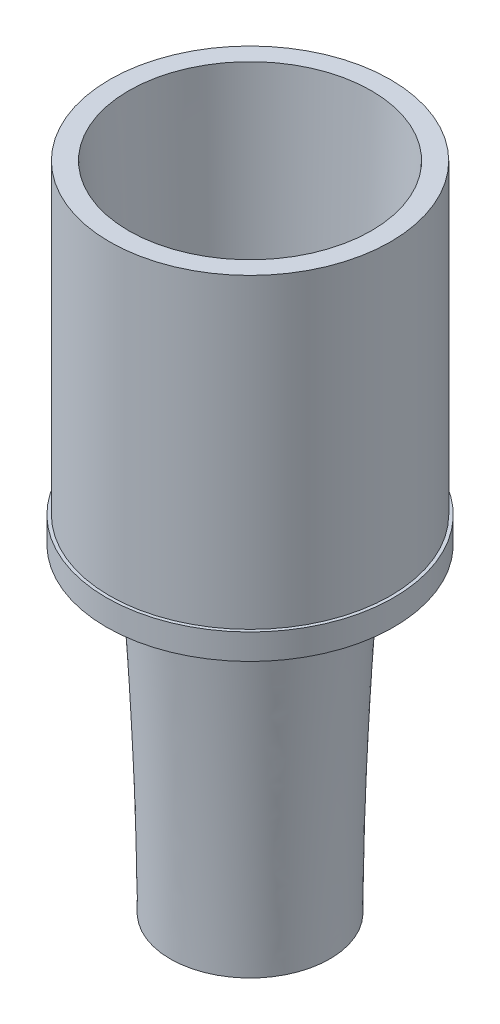
ISO-10303-21;
HEADER;
FILE_DESCRIPTION(('STEP AP214'),'2;1');
FILE_NAME('part.step','',(''),(''),'','','');
FILE_SCHEMA(('AUTOMOTIVE_DESIGN { 1 0 10303 214 1 1 1 1 }'));
ENDSEC;
DATA;
#1=APPLICATION_CONTEXT('core data for automotive mechanical design processes');
#2=APPLICATION_PROTOCOL_DEFINITION('international standard','automotive_design',2000,#1);
#3=PRODUCT_CONTEXT('',#1,'mechanical');
#4=PRODUCT('Part','Part','',(#3));
#5=PRODUCT_RELATED_PRODUCT_CATEGORY('part','',(#4));
#6=PRODUCT_DEFINITION_FORMATION('','',#4);
#7=PRODUCT_DEFINITION_CONTEXT('part definition',#1,'design');
#8=PRODUCT_DEFINITION('design','',#6,#7);
#9=PRODUCT_DEFINITION_SHAPE('','',#8);
#10=(LENGTH_UNIT() NAMED_UNIT(*) SI_UNIT(.MILLI.,.METRE.));
#11=(NAMED_UNIT(*) PLANE_ANGLE_UNIT() SI_UNIT($,.RADIAN.));
#12=(NAMED_UNIT(*) SI_UNIT($,.STERADIAN.) SOLID_ANGLE_UNIT());
#13=UNCERTAINTY_MEASURE_WITH_UNIT(LENGTH_MEASURE(1.E-05),#10,'distance_accuracy_value','');
#14=(GEOMETRIC_REPRESENTATION_CONTEXT(3) GLOBAL_UNCERTAINTY_ASSIGNED_CONTEXT((#13)) GLOBAL_UNIT_ASSIGNED_CONTEXT((#10,
#11,#12)) REPRESENTATION_CONTEXT('',''));
#15=CARTESIAN_POINT('',(0.,0.,0.));
#16=DIRECTION('',(0.,0.,1.));
#17=DIRECTION('',(1.,0.,0.));
#18=AXIS2_PLACEMENT_3D('',#15,#16,#17);
#19=CARTESIAN_POINT('',(0.,27.,0.));
#20=DIRECTION('',(0.,1.,0.));
#21=DIRECTION('',(0.,0.,1.));
#22=AXIS2_PLACEMENT_3D('',#19,#20,#21);
#23=PLANE('',#22);
#24=CARTESIAN_POINT('',(0.,27.,0.));
#25=DIRECTION('',(0.,1.,0.));
#26=DIRECTION('',(0.,0.,1.));
#27=AXIS2_PLACEMENT_3D('',#24,#25,#26);
#28=CIRCLE('',#27,5.75);
#29=CARTESIAN_POINT('',(0.,27.,5.75));
#30=VERTEX_POINT('',#29);
#31=EDGE_CURVE('E172',#30,#30,#28,.T.);
#32=ORIENTED_EDGE('',*,*,#31,.F.);
#33=EDGE_LOOP('',(#32));
#34=FACE_BOUND('',#33,.T.);
#35=CARTESIAN_POINT('',(0.,27.,0.));
#36=DIRECTION('',(0.,-1.,0.));
#37=DIRECTION('',(0.,0.,1.));
#38=AXIS2_PLACEMENT_3D('',#35,#36,#37);
#39=CIRCLE('',#38,8.5);
#40=CARTESIAN_POINT('',(0.,27.,8.5));
#41=VERTEX_POINT('',#40);
#42=EDGE_CURVE('E175',#41,#41,#39,.T.);
#43=ORIENTED_EDGE('',*,*,#42,.F.);
#44=EDGE_LOOP('',(#43));
#45=FACE_BOUND('',#44,.T.);
#46=ADVANCED_FACE('F55',(#34,#45),#23,.T.);
#47=CARTESIAN_POINT('',(0.,25.,0.));
#48=DIRECTION('',(0.,-1.,0.));
#49=DIRECTION('',(0.,0.,-1.));
#50=AXIS2_PLACEMENT_3D('',#47,#48,#49);
#51=CYLINDRICAL_SURFACE('',#50,7.25);
#52=CARTESIAN_POINT('',(0.,25.,0.));
#53=DIRECTION('',(0.,1.,0.));
#54=DIRECTION('',(0.,0.,1.));
#55=AXIS2_PLACEMENT_3D('',#52,#53,#54);
#56=CIRCLE('',#55,7.25);
#57=CARTESIAN_POINT('',(0.,25.,7.25));
#58=VERTEX_POINT('',#57);
#59=EDGE_CURVE('E65',#58,#58,#56,.T.);
#60=ORIENTED_EDGE('',*,*,#59,.F.);
#61=EDGE_LOOP('',(#60));
#62=FACE_BOUND('',#61,.T.);
#63=CARTESIAN_POINT('',(0.,24.5,0.));
#64=DIRECTION('',(0.,1.,0.));
#65=DIRECTION('',(0.,0.,1.));
#66=AXIS2_PLACEMENT_3D('',#63,#64,#65);
#67=CIRCLE('',#66,7.25);
#68=CARTESIAN_POINT('',(0.,24.5,7.25));
#69=VERTEX_POINT('',#68);
#70=EDGE_CURVE('E70',#69,#69,#67,.T.);
#71=ORIENTED_EDGE('',*,*,#70,.T.);
#72=EDGE_LOOP('',(#71));
#73=FACE_BOUND('',#72,.T.);
#74=ADVANCED_FACE('F162',(#62,#73),#51,.T.);
#75=CARTESIAN_POINT('',(0.,24.5,0.));
#76=DIRECTION('',(0.,1.,0.));
#77=DIRECTION('',(0.,0.,1.));
#78=AXIS2_PLACEMENT_3D('',#75,#76,#77);
#79=PLANE('',#78);
#80=CARTESIAN_POINT('',(0.,24.5,0.));
#81=DIRECTION('',(0.,1.,0.));
#82=DIRECTION('',(0.,0.,1.));
#83=AXIS2_PLACEMENT_3D('',#80,#81,#82);
#84=CIRCLE('',#83,7.21567156660949);
#85=CARTESIAN_POINT('',(-4.4192510764658,24.5,-5.70404558890727));
#86=VERTEX_POINT('',#85);
#87=EDGE_CURVE('E74',#86,#86,#84,.T.);
#88=ORIENTED_EDGE('',*,*,#87,.T.);
#89=EDGE_LOOP('',(#88));
#90=FACE_BOUND('',#89,.T.);
#91=ORIENTED_EDGE('',*,*,#70,.F.);
#92=EDGE_LOOP('',(#91));
#93=FACE_BOUND('',#92,.T.);
#94=ADVANCED_FACE('F167',(#90,#93),#79,.F.);
#95=CARTESIAN_POINT('',(-1.11708454091989,0.,-6.14935948928324));
#96=CARTESIAN_POINT('',(-4.48664223025245,25.,-5.69495755012409));
#97=CARTESIAN_POINT('',(-13.4158035194864,0.,-3.91519040744345));
#98=CARTESIAN_POINT('',(-15.8765573305006,25.,3.2783269103808));
#99=CARTESIAN_POINT('',(-11.1816344376466,0.,8.38352857112303));
#100=CARTESIAN_POINT('',(-6.90327286999572,25.,14.668242010629));
#101=CARTESIAN_POINT('',(1.1170845409199,0.,6.14935948928324));
#102=CARTESIAN_POINT('',(4.48664223025244,25.,5.69495755012409));
#103=CARTESIAN_POINT('',(13.4158035194864,0.,3.91519040744344));
#104=CARTESIAN_POINT('',(15.8765573305006,25.,-3.2783269103808));
#105=CARTESIAN_POINT('',(11.1816344376466,0.,-8.38352857112303));
#106=CARTESIAN_POINT('',(6.90327286999574,25.,-14.668242010629));
#107=CARTESIAN_POINT('',(-1.11708454091989,0.,-6.14935948928324));
#108=CARTESIAN_POINT('',(-4.48664223025245,25.,-5.69495755012409));
#109=(BOUNDED_SURFACE() B_SPLINE_SURFACE(3,1,((#95,#96),(#97,#98),(#99,#100),(#101,#102),(#103,
#104),(#105,#106),(#107,#108)),.UNSPECIFIED.,.T.,.F.,.F.) B_SPLINE_SURFACE_WITH_KNOTS((4,3,4),
(2,2),(0.,0.5,1.),(0.,1.),
.UNSPECIFIED.) GEOMETRIC_REPRESENTATION_ITEM() RATIONAL_B_SPLINE_SURFACE(((1.,1.),
(0.333333333333333,0.333333333333334),(0.333333333333333,0.333333333333334),(1.,1.),
(0.333333333333333,0.333333333333333),(0.333333333333333,0.333333333333333),(1.,1.))) REPRESENTATION_ITEM('') SURFACE());
#110=CARTESIAN_POINT('',(0.,0.,0.));
#111=DIRECTION('',(0.,1.,0.));
#112=DIRECTION('',(0.,0.,1.));
#113=AXIS2_PLACEMENT_3D('',#110,#111,#112);
#114=CIRCLE('',#113,6.25);
#115=CARTESIAN_POINT('',(-1.11708454091989,0.,-6.14935948928324));
#116=VERTEX_POINT('',#115);
#117=EDGE_CURVE('E12',#116,#116,#114,.T.);
#118=CARTESIAN_POINT('',(-1.11708454091989,0.,-6.14935948928324));
#119=CARTESIAN_POINT('',(-1.1514821089985,0.255208333333334,-6.14472080282099));
#120=CARTESIAN_POINT('',(-1.1858796770771,0.510416666666667,-6.14008211635874));
#121=CARTESIAN_POINT('',(-1.25467481323431,1.02083333333333,-6.13080474343424));
#122=CARTESIAN_POINT('',(-1.28907238131291,1.27604166666667,-6.12616605697199));
#123=CARTESIAN_POINT('',(-1.35786751747012,1.78645833333333,-6.11688868404749));
#124=CARTESIAN_POINT('',(-1.39226508554872,2.04166666666667,-6.11224999758524));
#125=CARTESIAN_POINT('',(-1.46106022170593,2.55208333333333,-6.10297262466074));
#126=CARTESIAN_POINT('',(-1.49545778978453,2.80729166666667,-6.09833393819849));
#127=CARTESIAN_POINT('',(-1.56425292594174,3.31770833333333,-6.08905656527399));
#128=CARTESIAN_POINT('',(-1.59865049402034,3.57291666666667,-6.08441787881174));
#129=CARTESIAN_POINT('',(-1.66744563017754,4.08333333333333,-6.07514050588724));
#130=CARTESIAN_POINT('',(-1.70184319825615,4.33854166666667,-6.07050181942499));
#131=CARTESIAN_POINT('',(-1.77063833441335,4.84895833333333,-6.06122444650049));
#132=CARTESIAN_POINT('',(-1.80503590249196,5.10416666666667,-6.05658576003824));
#133=CARTESIAN_POINT('',(-1.87383103864916,5.61458333333333,-6.04730838711374));
#134=CARTESIAN_POINT('',(-1.90822860672777,5.86979166666667,-6.0426697006515));
#135=CARTESIAN_POINT('',(-1.97702374288497,6.38020833333333,-6.033392327727));
#136=CARTESIAN_POINT('',(-2.01142131096358,6.63541666666667,-6.02875364126475));
#137=CARTESIAN_POINT('',(-2.08021644712078,7.14583333333333,-6.01947626834025));
#138=CARTESIAN_POINT('',(-2.11461401519939,7.40104166666667,-6.014837581878));
#139=CARTESIAN_POINT('',(-2.18340915135659,7.91145833333333,-6.0055602089535));
#140=CARTESIAN_POINT('',(-2.2178067194352,8.16666666666667,-6.00092152249125));
#141=CARTESIAN_POINT('',(-2.2866018555924,8.67708333333333,-5.99164414956675));
#142=CARTESIAN_POINT('',(-2.32099942367101,8.93229166666667,-5.9870054631045));
#143=CARTESIAN_POINT('',(-2.38979455982821,9.44270833333333,-5.97772809018));
#144=CARTESIAN_POINT('',(-2.42419212790681,9.69791666666667,-5.97308940371775));
#145=CARTESIAN_POINT('',(-2.49298726406402,10.2083333333333,-5.96381203079325));
#146=CARTESIAN_POINT('',(-2.52738483214262,10.4635416666667,-5.959173344331));
#147=CARTESIAN_POINT('',(-2.59617996829983,10.9739583333333,-5.9498959714065));
#148=CARTESIAN_POINT('',(-2.63057753637843,11.2291666666667,-5.94525728494425));
#149=CARTESIAN_POINT('',(-2.69937267253564,11.7395833333333,-5.93597991201975));
#150=CARTESIAN_POINT('',(-2.73377024061424,11.9947916666667,-5.9313412255575));
#151=CARTESIAN_POINT('',(-2.80256537677145,12.5052083333333,-5.922063852633));
#152=CARTESIAN_POINT('',(-2.83696294485005,12.7604166666667,-5.91742516617075));
#153=CARTESIAN_POINT('',(-2.90575808100726,13.2708333333333,-5.90814779324625));
#154=CARTESIAN_POINT('',(-2.94015564908586,13.5260416666667,-5.903509106784));
#155=CARTESIAN_POINT('',(-3.00895078524307,14.0364583333333,-5.89423173385951));
#156=CARTESIAN_POINT('',(-3.04334835332167,14.2916666666667,-5.88959304739726));
#157=CARTESIAN_POINT('',(-3.11214348947888,14.8020833333333,-5.88031567447276));
#158=CARTESIAN_POINT('',(-3.14654105755748,15.0572916666667,-5.87567698801051));
#159=CARTESIAN_POINT('',(-3.21533619371469,15.5677083333333,-5.86639961508601));
#160=CARTESIAN_POINT('',(-3.24973376179329,15.8229166666667,-5.86176092862376));
#161=CARTESIAN_POINT('',(-3.3185288979505,16.3333333333333,-5.85248355569926));
#162=CARTESIAN_POINT('',(-3.3529264660291,16.5885416666667,-5.84784486923701));
#163=CARTESIAN_POINT('',(-3.42172160218631,17.0989583333333,-5.83856749631251));
#164=CARTESIAN_POINT('',(-3.45611917026491,17.3541666666667,-5.83392880985026));
#165=CARTESIAN_POINT('',(-3.52491430642212,17.8645833333333,-5.82465143692576));
#166=CARTESIAN_POINT('',(-3.55931187450072,18.1197916666667,-5.82001275046351));
#167=CARTESIAN_POINT('',(-3.62810701065793,18.6302083333333,-5.81073537753901));
#168=CARTESIAN_POINT('',(-3.66250457873653,18.8854166666667,-5.80609669107676));
#169=CARTESIAN_POINT('',(-3.73129971489373,19.3958333333333,-5.79681931815226));
#170=CARTESIAN_POINT('',(-3.76569728297234,19.6510416666667,-5.79218063169001));
#171=CARTESIAN_POINT('',(-3.83449241912954,20.1614583333333,-5.78290325876551));
#172=CARTESIAN_POINT('',(-3.86888998720815,20.4166666666667,-5.77826457230326));
#173=CARTESIAN_POINT('',(-3.93768512336535,20.9270833333333,-5.76898719937877));
#174=CARTESIAN_POINT('',(-3.97208269144396,21.1822916666667,-5.76434851291652));
#175=CARTESIAN_POINT('',(-4.04087782760116,21.6927083333333,-5.75507113999202));
#176=CARTESIAN_POINT('',(-4.07527539567977,21.9479166666667,-5.75043245352977));
#177=CARTESIAN_POINT('',(-4.14407053183697,22.4583333333333,-5.74115508060527));
#178=CARTESIAN_POINT('',(-4.17846809991558,22.7135416666667,-5.73651639414302));
#179=CARTESIAN_POINT('',(-4.24726323607278,23.2239583333333,-5.72723902121852));
#180=CARTESIAN_POINT('',(-4.28166080415139,23.4791666666667,-5.72260033475627));
#181=CARTESIAN_POINT('',(-4.35045594030859,23.9895833333333,-5.71332296183177));
#182=CARTESIAN_POINT('',(-4.3848535083872,24.2447916666667,-5.70868427536952));
#183=CARTESIAN_POINT('',(-4.4192510764658,24.5,-5.70404558890727));
#184=B_SPLINE_CURVE_WITH_KNOTS('',3,(#118,#119,#120,#121,#122,#123,#124,#125,#126,#127,#128,
#129,#130,#131,#132,#133,#134,#135,#136,#137,#138,#139,#140,#141,#142,#143,#144,#145,#146,#147,
#148,#149,#150,#151,#152,#153,#154,#155,#156,#157,#158,#159,#160,#161,#162,#163,#164,#165,#166,
#167,#168,#169,#170,#171,#172,#173,#174,#175,#176,#177,#178,#179,#180,#181,#182,#183),
.UNSPECIFIED.,.F.,.F.,(4,2,2,2,2,2,2,2,2,2,2,2,2,2,2,2,2,2,2,2,2,2,2,2,2,2,2,2,2,2,2,2,4),(0.,
0.77267330194679,1.54534660389358,2.31801990584037,3.09069320778716,3.86336650973395,
4.63603981168074,5.40871311362753,6.18138641557432,6.95405971752111,7.7267330194679,
8.49940632141469,9.27207962336148,10.0447529253083,10.8174262272551,11.5900995292018,
12.3627728311486,13.1354461330954,13.9081194350422,14.680792736989,15.4534660389358,
16.2261393408826,16.9988126428294,17.7714859447762,18.5441592467229,19.3168325486697,
20.0895058506165,20.8621791525633,21.6348524545101,22.4075257564569,23.1801990584037,
23.9528723603505,24.7255456622973),.UNSPECIFIED.);
#185=EDGE_CURVE('BSEAM111',#116,#86,#184,.T.);
#186=ORIENTED_EDGE('',*,*,#117,.T.);
#187=ORIENTED_EDGE('',*,*,#87,.F.);
#188=ORIENTED_EDGE('',*,*,#185,.T.);
#189=ORIENTED_EDGE('',*,*,#185,.F.);
#190=EDGE_LOOP('',(#186,#188,#187,#189));
#191=FACE_BOUND('',#190,.T.);
#192=ADVANCED_FACE('F111',(#191),#109,.T.);
#193=CARTESIAN_POINT('',(0.,0.,0.));
#194=DIRECTION('',(0.,1.,0.));
#195=DIRECTION('',(0.,0.,1.));
#196=AXIS2_PLACEMENT_3D('',#193,#194,#195);
#197=PLANE('',#196);
#198=CARTESIAN_POINT('',(0.,0.,0.));
#199=DIRECTION('',(0.,-1.,0.));
#200=DIRECTION('',(0.,0.,-1.));
#201=AXIS2_PLACEMENT_3D('',#198,#199,#200);
#202=CIRCLE('',#201,4.75);
#203=CARTESIAN_POINT('',(0.,0.,-4.75));
#204=VERTEX_POINT('',#203);
#205=EDGE_CURVE('E76',#204,#204,#202,.T.);
#206=ORIENTED_EDGE('',*,*,#205,.F.);
#207=EDGE_LOOP('',(#206));
#208=FACE_BOUND('',#207,.T.);
#209=ORIENTED_EDGE('',*,*,#117,.F.);
#210=EDGE_LOOP('',(#209));
#211=FACE_BOUND('',#210,.T.);
#212=ADVANCED_FACE('F57',(#208,#211),#197,.F.);
#213=CARTESIAN_POINT('',(-5.75,25.,0.));
#214=CARTESIAN_POINT('',(-5.41666666666667,16.6666666666667,0.));
#215=CARTESIAN_POINT('',(-5.08333333333333,8.33333333333334,0.));
#216=CARTESIAN_POINT('',(-4.75,0.,0.));
#217=CARTESIAN_POINT('',(-5.75,25.,-0.158675565352893));
#218=CARTESIAN_POINT('',(-5.41666666666667,16.6666666666667,-0.149476981854173));
#219=CARTESIAN_POINT('',(-5.08333333333333,8.33333333333334,-0.140278398355454));
#220=CARTESIAN_POINT('',(-4.75,0.,-0.131079814856734));
#221=CARTESIAN_POINT('',(-5.73711755653529,25.,-0.473041582988096));
#222=CARTESIAN_POINT('',(-5.40453103151875,16.6666666666667,-0.445618882525017));
#223=CARTESIAN_POINT('',(-5.07194450650221,8.33333333333334,-0.418196182061938));
#224=CARTESIAN_POINT('',(-4.73935798148567,0.,-0.390773481598859));
#225=CARTESIAN_POINT('',(-5.68063116050321,25.,-0.934150670670049));
#226=CARTESIAN_POINT('',(-5.35131920916969,16.6666666666667,-0.879997008602219));
#227=CARTESIAN_POINT('',(-5.02200725783617,8.33333333333334,-0.825843346534389));
#228=CARTESIAN_POINT('',(-4.69269530650265,0.,-0.771689684466559));
#229=CARTESIAN_POINT('',(-5.58846663319524,25.,-1.38333522002203));
#230=CARTESIAN_POINT('',(-5.26449755301001,16.6666666666667,-1.30314187393379));
#231=CARTESIAN_POINT('',(-4.94052847282478,8.33333333333334,-1.22294852784556));
#232=CARTESIAN_POINT('',(-4.61655939263955,0.,-1.14275518175732));
#233=CARTESIAN_POINT('',(-4.83031827904677,25.,-3.99798768879932));
#234=CARTESIAN_POINT('',(-4.55029982808753,16.6666666666667,-3.76622028655009));
#235=CARTESIAN_POINT('',(-4.2702813771283,8.33333333333334,-3.53445288430085));
#236=CARTESIAN_POINT('',(-3.99026292616907,0.,-3.30268548205161));
#237=CARTESIAN_POINT('',(-2.53880904564626,25.,-5.75));
#238=CARTESIAN_POINT('',(-2.39163170966677,16.6666666666667,-5.41666666666667));
#239=CARTESIAN_POINT('',(-2.24445437368727,8.33333333333334,-5.08333333333333));
#240=CARTESIAN_POINT('',(-2.09727703770778,0.,-4.75));
#241=CARTESIAN_POINT('',(3.17351130705783,25.,-5.75));
#242=CARTESIAN_POINT('',(2.98953963708346,16.6666666666667,-5.41666666666667));
#243=CARTESIAN_POINT('',(2.80556796710909,8.33333333333334,-5.08333333333333));
#244=CARTESIAN_POINT('',(2.62159629713472,0.,-4.75));
#245=CARTESIAN_POINT('',(5.75,25.,-3.17351130705782));
#246=CARTESIAN_POINT('',(5.41666666666667,16.6666666666667,-2.98953963708346));
#247=CARTESIAN_POINT('',(5.08333333333333,8.33333333333334,-2.80556796710909));
#248=CARTESIAN_POINT('',(4.75,0.,-2.62159629713473));
#249=CARTESIAN_POINT('',(5.75,25.,3.17351130705783));
#250=CARTESIAN_POINT('',(5.41666666666667,16.6666666666667,2.98953963708346));
#251=CARTESIAN_POINT('',(5.08333333333333,8.33333333333334,2.80556796710909));
#252=CARTESIAN_POINT('',(4.75,0.,2.62159629713472));
#253=CARTESIAN_POINT('',(3.17351130705782,25.,5.75));
#254=CARTESIAN_POINT('',(2.98953963708346,16.6666666666667,5.41666666666667));
#255=CARTESIAN_POINT('',(2.80556796710909,8.33333333333334,5.08333333333333));
#256=CARTESIAN_POINT('',(2.62159629713473,0.,4.75));
#257=CARTESIAN_POINT('',(-2.53880904564626,25.,5.75));
#258=CARTESIAN_POINT('',(-2.39163170966677,16.6666666666667,5.41666666666667));
#259=CARTESIAN_POINT('',(-2.24445437368727,8.33333333333334,5.08333333333333));
#260=CARTESIAN_POINT('',(-2.09727703770778,0.,4.75));
#261=CARTESIAN_POINT('',(-4.83031827904677,25.,3.99798768879932));
#262=CARTESIAN_POINT('',(-4.55029982808754,16.6666666666667,3.76622028655009));
#263=CARTESIAN_POINT('',(-4.2702813771283,8.33333333333334,3.53445288430085));
#264=CARTESIAN_POINT('',(-3.99026292616907,0.,3.30268548205162));
#265=CARTESIAN_POINT('',(-5.58846663319524,25.,1.38333522002202));
#266=CARTESIAN_POINT('',(-5.26449755301001,16.6666666666667,1.30314187393379));
#267=CARTESIAN_POINT('',(-4.94052847282478,8.33333333333334,1.22294852784556));
#268=CARTESIAN_POINT('',(-4.61655939263955,0.,1.14275518175733));
#269=CARTESIAN_POINT('',(-5.68063116050321,25.,0.934150670670045));
#270=CARTESIAN_POINT('',(-5.35131920916969,16.6666666666667,0.879997008602217));
#271=CARTESIAN_POINT('',(-5.02200725783617,8.33333333333334,0.82584334653439));
#272=CARTESIAN_POINT('',(-4.69269530650265,0.,0.771689684466562));
#273=CARTESIAN_POINT('',(-5.73711755653529,25.,0.473041582988094));
#274=CARTESIAN_POINT('',(-5.40453103151875,16.6666666666667,0.445618882525017));
#275=CARTESIAN_POINT('',(-5.07194450650221,8.33333333333334,0.41819618206194));
#276=CARTESIAN_POINT('',(-4.73935798148567,0.,0.390773481598863));
#277=CARTESIAN_POINT('',(-5.75,25.,0.158675565352889));
#278=CARTESIAN_POINT('',(-5.41666666666667,16.6666666666667,0.149476981854172));
#279=CARTESIAN_POINT('',(-5.08333333333333,8.33333333333334,0.140278398355455));
#280=CARTESIAN_POINT('',(-4.75,0.,0.131079814856737));
#281=CARTESIAN_POINT('',(-5.75,25.,0.));
#282=CARTESIAN_POINT('',(-5.41666666666667,16.6666666666667,0.));
#283=CARTESIAN_POINT('',(-5.08333333333333,8.33333333333334,0.));
#284=CARTESIAN_POINT('',(-4.75,0.,0.));
#285=B_SPLINE_SURFACE_WITH_KNOTS('',3,3,((#213,#214,#215,#216),(#217,#218,#219,#220),(#221,#222,
#223,#224),(#225,#226,#227,#228),(#229,#230,#231,#232),(#233,#234,#235,#236),(#237,#238,#239,
#240),(#241,#242,#243,#244),(#245,#246,#247,#248),(#249,#250,#251,#252),(#253,#254,#255,#256),
(#257,#258,#259,#260),(#261,#262,#263,#264),(#265,#266,#267,#268),(#269,#270,#271,#272),(#273,
#274,#275,#276),(#277,#278,#279,#280),(#281,#282,#283,#284)),.UNSPECIFIED.,.T.,.F.,.F.,(4,1,1,1,
1,2,2,2,1,1,1,1,4),(4,4),(0.,0.0125,0.0249999999999999,0.0375000000000001,0.05,0.25,0.5,0.75,
0.95,0.9625,0.975,0.9875,1.),(0.,1.),.UNSPECIFIED.);
#286=CARTESIAN_POINT('',(-5.75,25.,0.));
#287=CARTESIAN_POINT('',(-5.75,25.,0.158675565352889));
#288=CARTESIAN_POINT('',(-5.73711755653529,25.,0.473041582988094));
#289=CARTESIAN_POINT('',(-5.68063116050321,25.,0.934150670670045));
#290=CARTESIAN_POINT('',(-5.58846663319524,25.,1.38333522002202));
#291=CARTESIAN_POINT('',(-4.83031827904677,25.,3.99798768879932));
#292=CARTESIAN_POINT('',(-2.53880904564626,25.,5.75));
#293=CARTESIAN_POINT('',(3.17351130705782,25.,5.75));
#294=CARTESIAN_POINT('',(5.75,25.,3.17351130705783));
#295=CARTESIAN_POINT('',(5.75,25.,-3.17351130705782));
#296=CARTESIAN_POINT('',(3.17351130705783,25.,-5.75));
#297=CARTESIAN_POINT('',(-2.53880904564626,25.,-5.75));
#298=CARTESIAN_POINT('',(-4.83031827904677,25.,-3.99798768879932));
#299=CARTESIAN_POINT('',(-5.58846663319524,25.,-1.38333522002203));
#300=CARTESIAN_POINT('',(-5.68063116050321,25.,-0.934150670670049));
#301=CARTESIAN_POINT('',(-5.73711755653529,25.,-0.473041582988096));
#302=CARTESIAN_POINT('',(-5.75,25.,-0.158675565352893));
#303=CARTESIAN_POINT('',(-5.75,25.,0.));
#304=B_SPLINE_CURVE_WITH_KNOTS('',3,(#286,#287,#288,#289,#290,#291,#292,#293,#294,#295,#296,
#297,#298,#299,#300,#301,#302,#303),.UNSPECIFIED.,.T.,.F.,(4,1,1,1,1,2,2,2,1,1,1,1,4),(0.,
0.0125,0.025,0.0375,0.05,0.25,0.5,0.75,0.95,0.9625,0.975,0.9875,1.),.UNSPECIFIED.);
#305=CARTESIAN_POINT('',(-5.75,25.,0.));
#306=VERTEX_POINT('',#305);
#307=EDGE_CURVE('E132',#306,#306,#304,.T.);
#308=ORIENTED_EDGE('',*,*,#307,.T.);
#309=EDGE_LOOP('',(#308));
#310=FACE_BOUND('',#309,.T.);
#311=ORIENTED_EDGE('',*,*,#205,.T.);
#312=EDGE_LOOP('',(#311));
#313=FACE_BOUND('',#312,.T.);
#314=ADVANCED_FACE('F95',(#310,#313),#285,.F.);
#315=CARTESIAN_POINT('',(0.,25.,0.));
#316=DIRECTION('',(0.,1.,0.));
#317=DIRECTION('',(0.,0.,1.));
#318=AXIS2_PLACEMENT_3D('',#315,#316,#317);
#319=PLANE('',#318);
#320=CARTESIAN_POINT('',(0.,25.,0.));
#321=DIRECTION('',(0.,1.,0.));
#322=DIRECTION('',(0.,0.,1.));
#323=AXIS2_PLACEMENT_3D('',#320,#321,#322);
#324=CIRCLE('',#323,11.25);
#325=CARTESIAN_POINT('',(0.,25.,11.25));
#326=VERTEX_POINT('',#325);
#327=EDGE_CURVE('E86',#326,#326,#324,.T.);
#328=ORIENTED_EDGE('',*,*,#327,.F.);
#329=EDGE_LOOP('',(#328));
#330=FACE_BOUND('',#329,.T.);
#331=ORIENTED_EDGE('',*,*,#59,.T.);
#332=EDGE_LOOP('',(#331));
#333=FACE_BOUND('',#332,.T.);
#334=ADVANCED_FACE('F107',(#330,#333),#319,.F.);
#335=CARTESIAN_POINT('',(0.,27.,0.));
#336=DIRECTION('',(0.,1.,0.));
#337=DIRECTION('',(0.,0.,1.));
#338=AXIS2_PLACEMENT_3D('',#335,#336,#337);
#339=CIRCLE('',#338,11.);
#340=CARTESIAN_POINT('',(0.,27.,11.));
#341=VERTEX_POINT('',#340);
#342=EDGE_CURVE('E177',#341,#341,#339,.T.);
#343=ORIENTED_EDGE('',*,*,#342,.F.);
#344=EDGE_LOOP('',(#343));
#345=FACE_BOUND('',#344,.T.);
#346=CARTESIAN_POINT('',(0.,27.,0.));
#347=DIRECTION('',(0.,1.,0.));
#348=DIRECTION('',(0.,0.,1.));
#349=AXIS2_PLACEMENT_3D('',#346,#347,#348);
#350=CIRCLE('',#349,11.25);
#351=CARTESIAN_POINT('',(0.,27.,11.25));
#352=VERTEX_POINT('',#351);
#353=EDGE_CURVE('E83',#352,#352,#350,.T.);
#354=ORIENTED_EDGE('',*,*,#353,.T.);
#355=EDGE_LOOP('',(#354));
#356=FACE_BOUND('',#355,.T.);
#357=ADVANCED_FACE('F152',(#345,#356),#23,.T.);
#358=CARTESIAN_POINT('',(0.,27.,0.));
#359=DIRECTION('',(0.,-1.,0.));
#360=DIRECTION('',(0.,0.,-1.));
#361=AXIS2_PLACEMENT_3D('',#358,#359,#360);
#362=CYLINDRICAL_SURFACE('',#361,11.25);
#363=ORIENTED_EDGE('',*,*,#353,.F.);
#364=EDGE_LOOP('',(#363));
#365=FACE_BOUND('',#364,.T.);
#366=ORIENTED_EDGE('',*,*,#327,.T.);
#367=EDGE_LOOP('',(#366));
#368=FACE_BOUND('',#367,.T.);
#369=ADVANCED_FACE('F109',(#365,#368),#362,.T.);
#370=CARTESIAN_POINT('',(0.,27.,0.));
#371=DIRECTION('',(0.,-1.,0.));
#372=DIRECTION('',(0.,0.,-1.));
#373=AXIS2_PLACEMENT_3D('',#370,#371,#372);
#374=CYLINDRICAL_SURFACE('',#373,5.75);
#375=ORIENTED_EDGE('',*,*,#31,.T.);
#376=EDGE_LOOP('',(#375));
#377=FACE_BOUND('',#376,.T.);
#378=ORIENTED_EDGE('',*,*,#307,.F.);
#379=EDGE_LOOP('',(#378));
#380=FACE_BOUND('',#379,.T.);
#381=ADVANCED_FACE('F138',(#377,#380),#374,.F.);
#382=CARTESIAN_POINT('',(0.,51.,0.));
#383=DIRECTION('',(0.,1.,0.));
#384=DIRECTION('',(0.,0.,1.));
#385=AXIS2_PLACEMENT_3D('',#382,#383,#384);
#386=PLANE('',#385);
#387=CARTESIAN_POINT('',(0.,51.,0.));
#388=DIRECTION('',(0.,1.,0.));
#389=DIRECTION('',(0.,0.,1.));
#390=AXIS2_PLACEMENT_3D('',#387,#388,#389);
#391=CIRCLE('',#390,9.5);
#392=CARTESIAN_POINT('',(0.,51.,9.5));
#393=VERTEX_POINT('',#392);
#394=EDGE_CURVE('E178',#393,#393,#391,.T.);
#395=ORIENTED_EDGE('',*,*,#394,.F.);
#396=EDGE_LOOP('',(#395));
#397=FACE_BOUND('',#396,.T.);
#398=CARTESIAN_POINT('',(0.,51.,0.));
#399=DIRECTION('',(0.,1.,0.));
#400=DIRECTION('',(0.,0.,1.));
#401=AXIS2_PLACEMENT_3D('',#398,#399,#400);
#402=CIRCLE('',#401,11.);
#403=CARTESIAN_POINT('',(0.,51.,11.));
#404=VERTEX_POINT('',#403);
#405=EDGE_CURVE('E181',#404,#404,#402,.T.);
#406=ORIENTED_EDGE('',*,*,#405,.T.);
#407=EDGE_LOOP('',(#406));
#408=FACE_BOUND('',#407,.T.);
#409=ADVANCED_FACE('F148',(#397,#408),#386,.T.);
#410=CARTESIAN_POINT('',(0.,51.,0.));
#411=DIRECTION('',(0.,-1.,0.));
#412=DIRECTION('',(0.,0.,-1.));
#413=AXIS2_PLACEMENT_3D('',#410,#411,#412);
#414=CYLINDRICAL_SURFACE('',#413,11.);
#415=ORIENTED_EDGE('',*,*,#405,.F.);
#416=EDGE_LOOP('',(#415));
#417=FACE_BOUND('',#416,.T.);
#418=ORIENTED_EDGE('',*,*,#342,.T.);
#419=EDGE_LOOP('',(#418));
#420=FACE_BOUND('',#419,.T.);
#421=ADVANCED_FACE('F150',(#417,#420),#414,.T.);
#422=CARTESIAN_POINT('',(0.,27.,0.));
#423=DIRECTION('',(0.,1.,0.));
#424=DIRECTION('',(0.,0.,1.));
#425=AXIS2_PLACEMENT_3D('',#422,#423,#424);
#426=CONICAL_SURFACE('',#425,8.5,0.0416425790985884);
#427=ORIENTED_EDGE('',*,*,#394,.T.);
#428=EDGE_LOOP('',(#427));
#429=FACE_BOUND('',#428,.T.);
#430=ORIENTED_EDGE('',*,*,#42,.T.);
#431=EDGE_LOOP('',(#430));
#432=FACE_BOUND('',#431,.T.);
#433=ADVANCED_FACE('F215',(#429,#432),#426,.F.);
#434=CLOSED_SHELL('',(#46,#74,#94,#192,#212,#314,#334,#357,#369,#381,#409,#421,#433));
#435=MANIFOLD_SOLID_BREP('B2',#434);
#436=ADVANCED_BREP_SHAPE_REPRESENTATION('',(#18,#435),#14);
#437=SHAPE_DEFINITION_REPRESENTATION(#9,#436);
ENDSEC;
END-ISO-10303-21;
